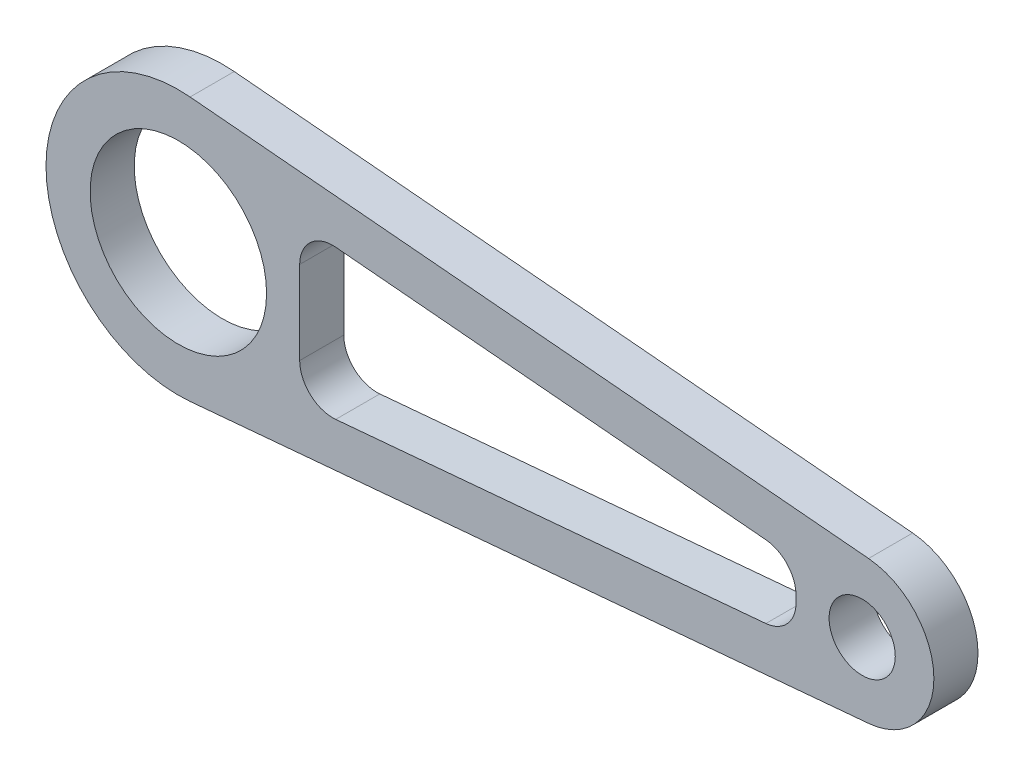
ISO-10303-21;
HEADER;
FILE_DESCRIPTION(('STEP AP214'),'2;1');
FILE_NAME('part.step','',(''),(''),'','','');
FILE_SCHEMA(('AUTOMOTIVE_DESIGN { 1 0 10303 214 1 1 1 1 }'));
ENDSEC;
DATA;
#1=APPLICATION_CONTEXT('core data for automotive mechanical design processes');
#2=APPLICATION_PROTOCOL_DEFINITION('international standard','automotive_design',2000,#1);
#3=PRODUCT_CONTEXT('',#1,'mechanical');
#4=PRODUCT('Part','Part','',(#3));
#5=PRODUCT_RELATED_PRODUCT_CATEGORY('part','',(#4));
#6=PRODUCT_DEFINITION_FORMATION('','',#4);
#7=PRODUCT_DEFINITION_CONTEXT('part definition',#1,'design');
#8=PRODUCT_DEFINITION('design','',#6,#7);
#9=PRODUCT_DEFINITION_SHAPE('','',#8);
#10=(LENGTH_UNIT() NAMED_UNIT(*) SI_UNIT(.MILLI.,.METRE.));
#11=(NAMED_UNIT(*) PLANE_ANGLE_UNIT() SI_UNIT($,.RADIAN.));
#12=(NAMED_UNIT(*) SI_UNIT($,.STERADIAN.) SOLID_ANGLE_UNIT());
#13=UNCERTAINTY_MEASURE_WITH_UNIT(LENGTH_MEASURE(1.E-05),#10,'distance_accuracy_value','');
#14=(GEOMETRIC_REPRESENTATION_CONTEXT(3) GLOBAL_UNCERTAINTY_ASSIGNED_CONTEXT((#13)) GLOBAL_UNIT_ASSIGNED_CONTEXT((#10,
#11,#12)) REPRESENTATION_CONTEXT('',''));
#15=CARTESIAN_POINT('',(0.,0.,0.));
#16=DIRECTION('',(0.,0.,1.));
#17=DIRECTION('',(1.,0.,0.));
#18=AXIS2_PLACEMENT_3D('',#15,#16,#17);
#19=CARTESIAN_POINT('',(0.,0.,2.));
#20=DIRECTION('',(0.,0.,1.));
#21=DIRECTION('',(1.,0.,0.));
#22=AXIS2_PLACEMENT_3D('',#19,#20,#21);
#23=PLANE('',#22);
#24=CARTESIAN_POINT('',(62.,0.,2.));
#25=DIRECTION('',(0.,0.,1.));
#26=DIRECTION('',(1.,0.,0.));
#27=AXIS2_PLACEMENT_3D('',#24,#25,#26);
#28=CIRCLE('',#27,3.00000000000001);
#29=CARTESIAN_POINT('',(65.,0.,2.));
#30=VERTEX_POINT('',#29);
#31=EDGE_CURVE('E188',#30,#30,#28,.T.);
#32=ORIENTED_EDGE('',*,*,#31,.F.);
#33=EDGE_LOOP('',(#32));
#34=FACE_BOUND('',#33,.T.);
#35=CARTESIAN_POINT('',(0.,0.,2.));
#36=DIRECTION('',(0.,0.,1.));
#37=DIRECTION('',(1.,0.,0.));
#38=AXIS2_PLACEMENT_3D('',#35,#36,#37);
#39=CIRCLE('',#38,12.);
#40=CARTESIAN_POINT('',(1.06451612903226,11.9526903001387,2.));
#41=VERTEX_POINT('',#40);
#42=CARTESIAN_POINT('',(1.06451612903226,-11.9526903001387,2.));
#43=VERTEX_POINT('',#42);
#44=EDGE_CURVE('E206',#41,#43,#39,.T.);
#45=ORIENTED_EDGE('',*,*,#44,.T.);
#46=DIRECTION('',(0.99605752501156,0.0887096774193549,0.));
#47=VECTOR('',#46,1.);
#48=CARTESIAN_POINT('',(1.06451612903226,-11.9526903001387,2.));
#49=LINE('',#48,#47);
#50=CARTESIAN_POINT('',(62.5766129032258,-6.47437391257514,2.));
#51=VERTEX_POINT('',#50);
#52=EDGE_CURVE('E209',#43,#51,#49,.T.);
#53=ORIENTED_EDGE('',*,*,#52,.T.);
#54=CARTESIAN_POINT('',(62.,0.,2.));
#55=DIRECTION('',(0.,0.,1.));
#56=DIRECTION('',(1.,0.,0.));
#57=AXIS2_PLACEMENT_3D('',#54,#55,#56);
#58=CIRCLE('',#57,6.5);
#59=CARTESIAN_POINT('',(62.5766129032258,6.47437391257514,2.));
#60=VERTEX_POINT('',#59);
#61=EDGE_CURVE('E211',#51,#60,#58,.T.);
#62=ORIENTED_EDGE('',*,*,#61,.T.);
#63=DIRECTION('',(-0.99605752501156,0.0887096774193549,0.));
#64=VECTOR('',#63,1.);
#65=CARTESIAN_POINT('',(1.06451612903226,11.9526903001387,2.));
#66=LINE('',#65,#64);
#67=EDGE_CURVE('E213',#60,#41,#66,.T.);
#68=ORIENTED_EDGE('',*,*,#67,.T.);
#69=EDGE_LOOP('',(#45,#53,#62,#68));
#70=FACE_BOUND('',#69,.T.);
#71=CARTESIAN_POINT('',(0.,0.,2.));
#72=DIRECTION('',(0.,0.,1.));
#73=DIRECTION('',(1.,0.,0.));
#74=AXIS2_PLACEMENT_3D('',#71,#72,#73);
#75=CIRCLE('',#74,8.);
#76=CARTESIAN_POINT('',(8.,0.,2.));
#77=VERTEX_POINT('',#76);
#78=EDGE_CURVE('E194',#77,#77,#75,.T.);
#79=ORIENTED_EDGE('',*,*,#78,.F.);
#80=EDGE_LOOP('',(#79));
#81=FACE_BOUND('',#80,.T.);
#82=DIRECTION('',(0.,1.,0.));
#83=VECTOR('',#82,1.);
#84=CARTESIAN_POINT('',(56.,0.29956813666029,2.));
#85=LINE('',#84,#83);
#86=CARTESIAN_POINT('',(56.,-0.299568136660289,2.));
#87=VERTEX_POINT('',#86);
#88=CARTESIAN_POINT('',(56.,0.299568136660291,2.));
#89=VERTEX_POINT('',#88);
#90=EDGE_CURVE('E160',#87,#89,#85,.T.);
#91=ORIENTED_EDGE('',*,*,#90,.F.);
#92=CARTESIAN_POINT('',(53.,-0.299568136660309,2.));
#93=DIRECTION('',(0.,0.,1.));
#94=DIRECTION('',(1.,0.,0.));
#95=AXIS2_PLACEMENT_3D('',#92,#93,#94);
#96=CIRCLE('',#95,3.);
#97=CARTESIAN_POINT('',(53.266129032258,-3.28774071169499,2.));
#98=VERTEX_POINT('',#97);
#99=EDGE_CURVE('E137',#98,#87,#96,.T.);
#100=ORIENTED_EDGE('',*,*,#99,.F.);
#101=DIRECTION('',(0.99605752501156,0.0887096774193549,0.));
#102=VECTOR('',#101,1.);
#103=CARTESIAN_POINT('',(14.2661290322581,-6.7611118097294,2.));
#104=LINE('',#103,#102);
#105=CARTESIAN_POINT('',(14.2661290322581,-6.7611118097294,2.));
#106=VERTEX_POINT('',#105);
#107=EDGE_CURVE('E172',#106,#98,#104,.T.);
#108=ORIENTED_EDGE('',*,*,#107,.F.);
#109=CARTESIAN_POINT('',(14.,-3.77293923469472,2.));
#110=DIRECTION('',(0.,0.,1.));
#111=DIRECTION('',(1.,0.,0.));
#112=AXIS2_PLACEMENT_3D('',#109,#110,#111);
#113=CIRCLE('',#112,3.);
#114=CARTESIAN_POINT('',(11.,-3.7729392346947,2.));
#115=VERTEX_POINT('',#114);
#116=EDGE_CURVE('E170',#115,#106,#113,.T.);
#117=ORIENTED_EDGE('',*,*,#116,.F.);
#118=DIRECTION('',(0.,-1.,0.));
#119=VECTOR('',#118,1.);
#120=CARTESIAN_POINT('',(11.,3.7729392346947,2.));
#121=LINE('',#120,#119);
#122=CARTESIAN_POINT('',(11.,3.7729392346947,2.));
#123=VERTEX_POINT('',#122);
#124=EDGE_CURVE('E168',#123,#115,#121,.T.);
#125=ORIENTED_EDGE('',*,*,#124,.F.);
#126=CARTESIAN_POINT('',(14.,3.77293923469472,2.));
#127=DIRECTION('',(0.,0.,1.));
#128=DIRECTION('',(-1.,0.,0.));
#129=AXIS2_PLACEMENT_3D('',#126,#127,#128);
#130=CIRCLE('',#129,3.);
#131=CARTESIAN_POINT('',(14.2661290322581,6.7611118097294,2.));
#132=VERTEX_POINT('',#131);
#133=EDGE_CURVE('E166',#132,#123,#130,.T.);
#134=ORIENTED_EDGE('',*,*,#133,.F.);
#135=DIRECTION('',(-0.99605752501156,0.0887096774193549,0.));
#136=VECTOR('',#135,1.);
#137=CARTESIAN_POINT('',(14.2661290322581,6.7611118097294,2.));
#138=LINE('',#137,#136);
#139=CARTESIAN_POINT('',(53.266129032258,3.28774071169499,2.));
#140=VERTEX_POINT('',#139);
#141=EDGE_CURVE('E164',#140,#132,#138,.T.);
#142=ORIENTED_EDGE('',*,*,#141,.F.);
#143=CARTESIAN_POINT('',(53.,0.299568136660309,2.));
#144=DIRECTION('',(0.,0.,1.));
#145=DIRECTION('',(1.,0.,0.));
#146=AXIS2_PLACEMENT_3D('',#143,#144,#145);
#147=CIRCLE('',#146,3.);
#148=EDGE_CURVE('E162',#89,#140,#147,.T.);
#149=ORIENTED_EDGE('',*,*,#148,.F.);
#150=EDGE_LOOP('',(#91,#100,#108,#117,#125,#134,#142,#149));
#151=FACE_BOUND('',#150,.T.);
#152=ADVANCED_FACE('F33',(#34,#70,#81,#151),#23,.T.);
#153=CARTESIAN_POINT('',(0.,0.,-2.));
#154=DIRECTION('',(0.,0.,1.));
#155=DIRECTION('',(1.,0.,0.));
#156=AXIS2_PLACEMENT_3D('',#153,#154,#155);
#157=PLANE('',#156);
#158=CARTESIAN_POINT('',(62.,0.,-2.));
#159=DIRECTION('',(0.,0.,1.));
#160=DIRECTION('',(1.,0.,0.));
#161=AXIS2_PLACEMENT_3D('',#158,#159,#160);
#162=CIRCLE('',#161,3.00000000000001);
#163=CARTESIAN_POINT('',(65.,0.,-2.));
#164=VERTEX_POINT('',#163);
#165=EDGE_CURVE('E138',#164,#164,#162,.T.);
#166=ORIENTED_EDGE('',*,*,#165,.T.);
#167=EDGE_LOOP('',(#166));
#168=FACE_BOUND('',#167,.T.);
#169=CARTESIAN_POINT('',(0.,0.,-2.));
#170=DIRECTION('',(0.,0.,1.));
#171=DIRECTION('',(1.,0.,0.));
#172=AXIS2_PLACEMENT_3D('',#169,#170,#171);
#173=CIRCLE('',#172,12.);
#174=CARTESIAN_POINT('',(1.06451612903226,11.9526903001387,-2.));
#175=VERTEX_POINT('',#174);
#176=CARTESIAN_POINT('',(1.06451612903226,-11.9526903001387,-2.));
#177=VERTEX_POINT('',#176);
#178=EDGE_CURVE('E197',#175,#177,#173,.T.);
#179=ORIENTED_EDGE('',*,*,#178,.F.);
#180=DIRECTION('',(-0.99605752501156,0.0887096774193549,0.));
#181=VECTOR('',#180,1.);
#182=CARTESIAN_POINT('',(1.06451612903226,11.9526903001387,-2.));
#183=LINE('',#182,#181);
#184=CARTESIAN_POINT('',(62.5766129032258,6.47437391257514,-2.));
#185=VERTEX_POINT('',#184);
#186=EDGE_CURVE('E204',#185,#175,#183,.T.);
#187=ORIENTED_EDGE('',*,*,#186,.F.);
#188=CARTESIAN_POINT('',(62.,0.,-2.));
#189=DIRECTION('',(0.,0.,1.));
#190=DIRECTION('',(1.,0.,0.));
#191=AXIS2_PLACEMENT_3D('',#188,#189,#190);
#192=CIRCLE('',#191,6.5);
#193=CARTESIAN_POINT('',(62.5766129032258,-6.47437391257514,-2.));
#194=VERTEX_POINT('',#193);
#195=EDGE_CURVE('E202',#194,#185,#192,.T.);
#196=ORIENTED_EDGE('',*,*,#195,.F.);
#197=DIRECTION('',(0.99605752501156,0.0887096774193549,0.));
#198=VECTOR('',#197,1.);
#199=CARTESIAN_POINT('',(1.06451612903226,-11.9526903001387,-2.));
#200=LINE('',#199,#198);
#201=EDGE_CURVE('E200',#177,#194,#200,.T.);
#202=ORIENTED_EDGE('',*,*,#201,.F.);
#203=EDGE_LOOP('',(#179,#187,#196,#202));
#204=FACE_BOUND('',#203,.T.);
#205=CARTESIAN_POINT('',(0.,0.,-2.));
#206=DIRECTION('',(0.,0.,1.));
#207=DIRECTION('',(1.,0.,0.));
#208=AXIS2_PLACEMENT_3D('',#205,#206,#207);
#209=CIRCLE('',#208,8.);
#210=CARTESIAN_POINT('',(8.,0.,-2.));
#211=VERTEX_POINT('',#210);
#212=EDGE_CURVE('E191',#211,#211,#209,.T.);
#213=ORIENTED_EDGE('',*,*,#212,.T.);
#214=EDGE_LOOP('',(#213));
#215=FACE_BOUND('',#214,.T.);
#216=CARTESIAN_POINT('',(53.,-0.299568136660309,-2.));
#217=DIRECTION('',(0.,0.,1.));
#218=DIRECTION('',(1.,0.,0.));
#219=AXIS2_PLACEMENT_3D('',#216,#217,#218);
#220=CIRCLE('',#219,3.);
#221=CARTESIAN_POINT('',(53.266129032258,-3.28774071169499,-2.));
#222=VERTEX_POINT('',#221);
#223=CARTESIAN_POINT('',(56.,-0.299568136660289,-2.));
#224=VERTEX_POINT('',#223);
#225=EDGE_CURVE('E56',#222,#224,#220,.T.);
#226=ORIENTED_EDGE('',*,*,#225,.T.);
#227=DIRECTION('',(0.,1.,0.));
#228=VECTOR('',#227,1.);
#229=CARTESIAN_POINT('',(56.,0.29956813666029,-2.));
#230=LINE('',#229,#228);
#231=CARTESIAN_POINT('',(56.,0.299568136660291,-2.));
#232=VERTEX_POINT('',#231);
#233=EDGE_CURVE('E124',#224,#232,#230,.T.);
#234=ORIENTED_EDGE('',*,*,#233,.T.);
#235=CARTESIAN_POINT('',(53.,0.299568136660309,-2.));
#236=DIRECTION('',(0.,0.,1.));
#237=DIRECTION('',(1.,0.,0.));
#238=AXIS2_PLACEMENT_3D('',#235,#236,#237);
#239=CIRCLE('',#238,3.);
#240=CARTESIAN_POINT('',(53.266129032258,3.28774071169499,-2.));
#241=VERTEX_POINT('',#240);
#242=EDGE_CURVE('E133',#232,#241,#239,.T.);
#243=ORIENTED_EDGE('',*,*,#242,.T.);
#244=DIRECTION('',(-0.99605752501156,0.0887096774193549,0.));
#245=VECTOR('',#244,1.);
#246=CARTESIAN_POINT('',(14.2661290322581,6.7611118097294,-2.));
#247=LINE('',#246,#245);
#248=CARTESIAN_POINT('',(14.2661290322581,6.7611118097294,-2.));
#249=VERTEX_POINT('',#248);
#250=EDGE_CURVE('E147',#241,#249,#247,.T.);
#251=ORIENTED_EDGE('',*,*,#250,.T.);
#252=CARTESIAN_POINT('',(14.,3.77293923469472,-2.));
#253=DIRECTION('',(0.,0.,1.));
#254=DIRECTION('',(-1.,0.,0.));
#255=AXIS2_PLACEMENT_3D('',#252,#253,#254);
#256=CIRCLE('',#255,3.);
#257=CARTESIAN_POINT('',(11.,3.7729392346947,-2.));
#258=VERTEX_POINT('',#257);
#259=EDGE_CURVE('E150',#249,#258,#256,.T.);
#260=ORIENTED_EDGE('',*,*,#259,.T.);
#261=DIRECTION('',(0.,-1.,0.));
#262=VECTOR('',#261,1.);
#263=CARTESIAN_POINT('',(11.,3.7729392346947,-2.));
#264=LINE('',#263,#262);
#265=CARTESIAN_POINT('',(11.,-3.7729392346947,-2.));
#266=VERTEX_POINT('',#265);
#267=EDGE_CURVE('E153',#258,#266,#264,.T.);
#268=ORIENTED_EDGE('',*,*,#267,.T.);
#269=CARTESIAN_POINT('',(14.,-3.77293923469472,-2.));
#270=DIRECTION('',(0.,0.,1.));
#271=DIRECTION('',(1.,0.,0.));
#272=AXIS2_PLACEMENT_3D('',#269,#270,#271);
#273=CIRCLE('',#272,3.);
#274=CARTESIAN_POINT('',(14.2661290322581,-6.7611118097294,-2.));
#275=VERTEX_POINT('',#274);
#276=EDGE_CURVE('E156',#266,#275,#273,.T.);
#277=ORIENTED_EDGE('',*,*,#276,.T.);
#278=DIRECTION('',(0.99605752501156,0.0887096774193549,0.));
#279=VECTOR('',#278,1.);
#280=CARTESIAN_POINT('',(14.2661290322581,-6.7611118097294,-2.));
#281=LINE('',#280,#279);
#282=EDGE_CURVE('E143',#275,#222,#281,.T.);
#283=ORIENTED_EDGE('',*,*,#282,.T.);
#284=EDGE_LOOP('',(#226,#234,#243,#251,#260,#268,#277,#283));
#285=FACE_BOUND('',#284,.T.);
#286=ADVANCED_FACE('F141',(#168,#204,#215,#285),#157,.F.);
#287=CARTESIAN_POINT('',(0.,0.,2.));
#288=DIRECTION('',(0.,0.,-1.));
#289=DIRECTION('',(-1.,0.,0.));
#290=AXIS2_PLACEMENT_3D('',#287,#288,#289);
#291=CYLINDRICAL_SURFACE('',#290,12.);
#292=ORIENTED_EDGE('',*,*,#178,.T.);
#293=DIRECTION('',(0.,0.,-1.));
#294=VECTOR('',#293,1.);
#295=CARTESIAN_POINT('',(1.06451612903226,-11.9526903001387,2.));
#296=LINE('',#295,#294);
#297=EDGE_CURVE('E11',#43,#177,#296,.T.);
#298=ORIENTED_EDGE('',*,*,#297,.F.);
#299=ORIENTED_EDGE('',*,*,#44,.F.);
#300=DIRECTION('',(0.,0.,-1.));
#301=VECTOR('',#300,1.);
#302=CARTESIAN_POINT('',(1.06451612903226,11.9526903001387,2.));
#303=LINE('',#302,#301);
#304=EDGE_CURVE('E215',#41,#175,#303,.T.);
#305=ORIENTED_EDGE('',*,*,#304,.T.);
#306=EDGE_LOOP('',(#292,#298,#299,#305));
#307=FACE_BOUND('',#306,.T.);
#308=ADVANCED_FACE('F35',(#307),#291,.T.);
#309=CARTESIAN_POINT('',(1.06451612903226,-11.9526903001387,2.));
#310=DIRECTION('',(-0.0887096774193549,0.99605752501156,0.));
#311=DIRECTION('',(-0.99605752501156,-0.0887096774193549,0.));
#312=AXIS2_PLACEMENT_3D('',#309,#310,#311);
#313=PLANE('',#312);
#314=ORIENTED_EDGE('',*,*,#201,.T.);
#315=DIRECTION('',(0.,0.,-1.));
#316=VECTOR('',#315,1.);
#317=CARTESIAN_POINT('',(62.5766129032258,-6.47437391257514,2.));
#318=LINE('',#317,#316);
#319=EDGE_CURVE('E41',#51,#194,#318,.T.);
#320=ORIENTED_EDGE('',*,*,#319,.F.);
#321=ORIENTED_EDGE('',*,*,#52,.F.);
#322=ORIENTED_EDGE('',*,*,#297,.T.);
#323=EDGE_LOOP('',(#314,#320,#321,#322));
#324=FACE_BOUND('',#323,.T.);
#325=ADVANCED_FACE('F241',(#324),#313,.F.);
#326=CARTESIAN_POINT('',(62.,0.,2.));
#327=DIRECTION('',(0.,0.,-1.));
#328=DIRECTION('',(-1.,0.,0.));
#329=AXIS2_PLACEMENT_3D('',#326,#327,#328);
#330=CYLINDRICAL_SURFACE('',#329,6.5);
#331=ORIENTED_EDGE('',*,*,#195,.T.);
#332=DIRECTION('',(0.,0.,-1.));
#333=VECTOR('',#332,1.);
#334=CARTESIAN_POINT('',(62.5766129032258,6.47437391257514,2.));
#335=LINE('',#334,#333);
#336=EDGE_CURVE('E218',#60,#185,#335,.T.);
#337=ORIENTED_EDGE('',*,*,#336,.F.);
#338=ORIENTED_EDGE('',*,*,#61,.F.);
#339=ORIENTED_EDGE('',*,*,#319,.T.);
#340=EDGE_LOOP('',(#331,#337,#338,#339));
#341=FACE_BOUND('',#340,.T.);
#342=ADVANCED_FACE('F225',(#341),#330,.T.);
#343=CARTESIAN_POINT('',(1.06451612903226,11.9526903001387,2.));
#344=DIRECTION('',(-0.0887096774193549,-0.99605752501156,0.));
#345=DIRECTION('',(0.99605752501156,-0.0887096774193549,0.));
#346=AXIS2_PLACEMENT_3D('',#343,#344,#345);
#347=PLANE('',#346);
#348=ORIENTED_EDGE('',*,*,#186,.T.);
#349=ORIENTED_EDGE('',*,*,#304,.F.);
#350=ORIENTED_EDGE('',*,*,#67,.F.);
#351=ORIENTED_EDGE('',*,*,#336,.T.);
#352=EDGE_LOOP('',(#348,#349,#350,#351));
#353=FACE_BOUND('',#352,.T.);
#354=ADVANCED_FACE('F234',(#353),#347,.F.);
#355=CARTESIAN_POINT('',(0.,0.,2.));
#356=DIRECTION('',(0.,0.,-1.));
#357=DIRECTION('',(-1.,0.,0.));
#358=AXIS2_PLACEMENT_3D('',#355,#356,#357);
#359=CYLINDRICAL_SURFACE('',#358,8.);
#360=ORIENTED_EDGE('',*,*,#78,.T.);
#361=EDGE_LOOP('',(#360));
#362=FACE_BOUND('',#361,.T.);
#363=ORIENTED_EDGE('',*,*,#212,.F.);
#364=EDGE_LOOP('',(#363));
#365=FACE_BOUND('',#364,.T.);
#366=ADVANCED_FACE('F260',(#362,#365),#359,.F.);
#367=CARTESIAN_POINT('',(62.,0.,2.));
#368=DIRECTION('',(0.,0.,-1.));
#369=DIRECTION('',(-1.,0.,0.));
#370=AXIS2_PLACEMENT_3D('',#367,#368,#369);
#371=CYLINDRICAL_SURFACE('',#370,3.00000000000001);
#372=ORIENTED_EDGE('',*,*,#31,.T.);
#373=EDGE_LOOP('',(#372));
#374=FACE_BOUND('',#373,.T.);
#375=ORIENTED_EDGE('',*,*,#165,.F.);
#376=EDGE_LOOP('',(#375));
#377=FACE_BOUND('',#376,.T.);
#378=ADVANCED_FACE('F264',(#374,#377),#371,.F.);
#379=CARTESIAN_POINT('',(53.,-0.299568136660309,2.));
#380=DIRECTION('',(0.,0.,-1.));
#381=DIRECTION('',(-1.,0.,0.));
#382=AXIS2_PLACEMENT_3D('',#379,#380,#381);
#383=CYLINDRICAL_SURFACE('',#382,3.);
#384=ORIENTED_EDGE('',*,*,#225,.F.);
#385=DIRECTION('',(0.,0.,-1.));
#386=VECTOR('',#385,1.);
#387=CARTESIAN_POINT('',(53.266129032258,-3.28774071169499,2.));
#388=LINE('',#387,#386);
#389=EDGE_CURVE('E174',#98,#222,#388,.T.);
#390=ORIENTED_EDGE('',*,*,#389,.F.);
#391=ORIENTED_EDGE('',*,*,#99,.T.);
#392=DIRECTION('',(0.,0.,-1.));
#393=VECTOR('',#392,1.);
#394=CARTESIAN_POINT('',(56.,-0.299568136660289,2.));
#395=LINE('',#394,#393);
#396=EDGE_CURVE('E126',#87,#224,#395,.T.);
#397=ORIENTED_EDGE('',*,*,#396,.T.);
#398=EDGE_LOOP('',(#384,#390,#391,#397));
#399=FACE_BOUND('',#398,.T.);
#400=ADVANCED_FACE('F135',(#399),#383,.F.);
#401=CARTESIAN_POINT('',(56.,0.29956813666029,2.));
#402=DIRECTION('',(-1.,0.,0.));
#403=DIRECTION('',(0.,0.,1.));
#404=AXIS2_PLACEMENT_3D('',#401,#402,#403);
#405=PLANE('',#404);
#406=ORIENTED_EDGE('',*,*,#233,.F.);
#407=ORIENTED_EDGE('',*,*,#396,.F.);
#408=ORIENTED_EDGE('',*,*,#90,.T.);
#409=DIRECTION('',(0.,0.,-1.));
#410=VECTOR('',#409,1.);
#411=CARTESIAN_POINT('',(56.,0.299568136660291,2.));
#412=LINE('',#411,#410);
#413=EDGE_CURVE('E129',#89,#232,#412,.T.);
#414=ORIENTED_EDGE('',*,*,#413,.T.);
#415=EDGE_LOOP('',(#406,#407,#408,#414));
#416=FACE_BOUND('',#415,.T.);
#417=ADVANCED_FACE('F125',(#416),#405,.T.);
#418=CARTESIAN_POINT('',(53.,0.299568136660309,2.));
#419=DIRECTION('',(0.,0.,-1.));
#420=DIRECTION('',(-1.,0.,0.));
#421=AXIS2_PLACEMENT_3D('',#418,#419,#420);
#422=CYLINDRICAL_SURFACE('',#421,3.);
#423=ORIENTED_EDGE('',*,*,#242,.F.);
#424=ORIENTED_EDGE('',*,*,#413,.F.);
#425=ORIENTED_EDGE('',*,*,#148,.T.);
#426=DIRECTION('',(0.,0.,-1.));
#427=VECTOR('',#426,1.);
#428=CARTESIAN_POINT('',(53.266129032258,3.28774071169499,2.));
#429=LINE('',#428,#427);
#430=EDGE_CURVE('E183',#140,#241,#429,.T.);
#431=ORIENTED_EDGE('',*,*,#430,.T.);
#432=EDGE_LOOP('',(#423,#424,#425,#431));
#433=FACE_BOUND('',#432,.T.);
#434=ADVANCED_FACE('F277',(#433),#422,.F.);
#435=CARTESIAN_POINT('',(14.2661290322581,6.7611118097294,2.));
#436=DIRECTION('',(-0.0887096774193549,-0.99605752501156,0.));
#437=DIRECTION('',(0.99605752501156,-0.0887096774193549,0.));
#438=AXIS2_PLACEMENT_3D('',#435,#436,#437);
#439=PLANE('',#438);
#440=ORIENTED_EDGE('',*,*,#250,.F.);
#441=ORIENTED_EDGE('',*,*,#430,.F.);
#442=ORIENTED_EDGE('',*,*,#141,.T.);
#443=DIRECTION('',(0.,0.,-1.));
#444=VECTOR('',#443,1.);
#445=CARTESIAN_POINT('',(14.2661290322581,6.7611118097294,2.));
#446=LINE('',#445,#444);
#447=EDGE_CURVE('E181',#132,#249,#446,.T.);
#448=ORIENTED_EDGE('',*,*,#447,.T.);
#449=EDGE_LOOP('',(#440,#441,#442,#448));
#450=FACE_BOUND('',#449,.T.);
#451=ADVANCED_FACE('F280',(#450),#439,.T.);
#452=CARTESIAN_POINT('',(14.,3.77293923469472,2.));
#453=DIRECTION('',(0.,0.,-1.));
#454=DIRECTION('',(-1.,0.,0.));
#455=AXIS2_PLACEMENT_3D('',#452,#453,#454);
#456=CYLINDRICAL_SURFACE('',#455,3.);
#457=ORIENTED_EDGE('',*,*,#259,.F.);
#458=ORIENTED_EDGE('',*,*,#447,.F.);
#459=ORIENTED_EDGE('',*,*,#133,.T.);
#460=DIRECTION('',(0.,0.,-1.));
#461=VECTOR('',#460,1.);
#462=CARTESIAN_POINT('',(11.,3.7729392346947,2.));
#463=LINE('',#462,#461);
#464=EDGE_CURVE('E179',#123,#258,#463,.T.);
#465=ORIENTED_EDGE('',*,*,#464,.T.);
#466=EDGE_LOOP('',(#457,#458,#459,#465));
#467=FACE_BOUND('',#466,.T.);
#468=ADVANCED_FACE('F284',(#467),#456,.F.);
#469=CARTESIAN_POINT('',(11.,3.7729392346947,2.));
#470=DIRECTION('',(1.,0.,0.));
#471=DIRECTION('',(0.,1.,0.));
#472=AXIS2_PLACEMENT_3D('',#469,#470,#471);
#473=PLANE('',#472);
#474=ORIENTED_EDGE('',*,*,#267,.F.);
#475=ORIENTED_EDGE('',*,*,#464,.F.);
#476=ORIENTED_EDGE('',*,*,#124,.T.);
#477=DIRECTION('',(0.,0.,-1.));
#478=VECTOR('',#477,1.);
#479=CARTESIAN_POINT('',(11.,-3.7729392346947,2.));
#480=LINE('',#479,#478);
#481=EDGE_CURVE('E177',#115,#266,#480,.T.);
#482=ORIENTED_EDGE('',*,*,#481,.T.);
#483=EDGE_LOOP('',(#474,#475,#476,#482));
#484=FACE_BOUND('',#483,.T.);
#485=ADVANCED_FACE('F288',(#484),#473,.T.);
#486=CARTESIAN_POINT('',(14.,-3.77293923469472,2.));
#487=DIRECTION('',(0.,0.,-1.));
#488=DIRECTION('',(-1.,0.,0.));
#489=AXIS2_PLACEMENT_3D('',#486,#487,#488);
#490=CYLINDRICAL_SURFACE('',#489,3.);
#491=ORIENTED_EDGE('',*,*,#276,.F.);
#492=ORIENTED_EDGE('',*,*,#481,.F.);
#493=ORIENTED_EDGE('',*,*,#116,.T.);
#494=DIRECTION('',(0.,0.,-1.));
#495=VECTOR('',#494,1.);
#496=CARTESIAN_POINT('',(14.2661290322581,-6.7611118097294,2.));
#497=LINE('',#496,#495);
#498=EDGE_CURVE('E48',#106,#275,#497,.T.);
#499=ORIENTED_EDGE('',*,*,#498,.T.);
#500=EDGE_LOOP('',(#491,#492,#493,#499));
#501=FACE_BOUND('',#500,.T.);
#502=ADVANCED_FACE('F292',(#501),#490,.F.);
#503=CARTESIAN_POINT('',(14.2661290322581,-6.7611118097294,2.));
#504=DIRECTION('',(-0.0887096774193549,0.99605752501156,0.));
#505=DIRECTION('',(-0.99605752501156,-0.0887096774193549,0.));
#506=AXIS2_PLACEMENT_3D('',#503,#504,#505);
#507=PLANE('',#506);
#508=ORIENTED_EDGE('',*,*,#282,.F.);
#509=ORIENTED_EDGE('',*,*,#498,.F.);
#510=ORIENTED_EDGE('',*,*,#107,.T.);
#511=ORIENTED_EDGE('',*,*,#389,.T.);
#512=EDGE_LOOP('',(#508,#509,#510,#511));
#513=FACE_BOUND('',#512,.T.);
#514=ADVANCED_FACE('F296',(#513),#507,.T.);
#515=CLOSED_SHELL('',(#152,#286,#308,#325,#342,#354,#366,#378,#400,#417,#434,#451,#468,#485,
#502,#514));
#516=MANIFOLD_SOLID_BREP('B2',#515);
#517=ADVANCED_BREP_SHAPE_REPRESENTATION('',(#18,#516),#14);
#518=SHAPE_DEFINITION_REPRESENTATION(#9,#517);
ENDSEC;
END-ISO-10303-21;
